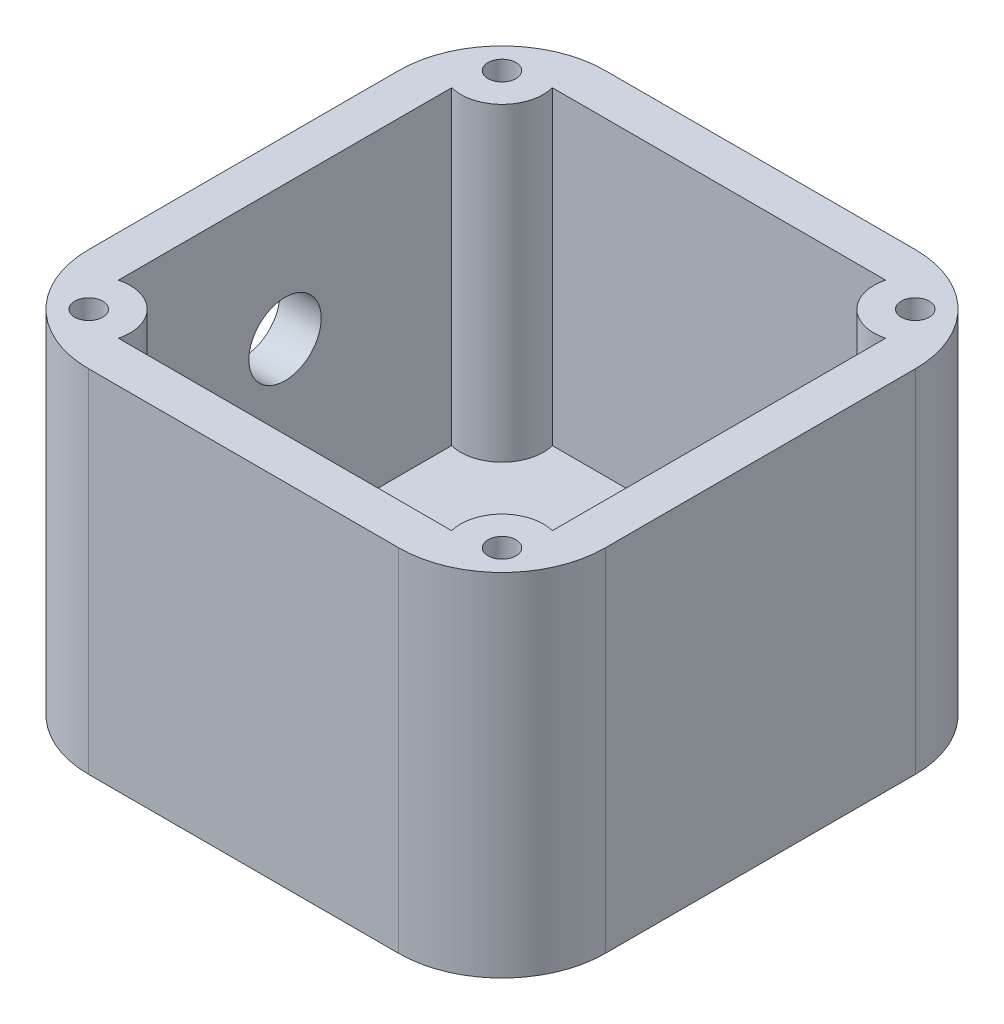
ISO-10303-21;
HEADER;
FILE_DESCRIPTION(('STEP AP214'),'2;1');
FILE_NAME('part.step','',(''),(''),'','','');
FILE_SCHEMA(('AUTOMOTIVE_DESIGN { 1 0 10303 214 1 1 1 1 }'));
ENDSEC;
DATA;
#1=APPLICATION_CONTEXT('core data for automotive mechanical design processes');
#2=APPLICATION_PROTOCOL_DEFINITION('international standard','automotive_design',2000,#1);
#3=PRODUCT_CONTEXT('',#1,'mechanical');
#4=PRODUCT('Part','Part','',(#3));
#5=PRODUCT_RELATED_PRODUCT_CATEGORY('part','',(#4));
#6=PRODUCT_DEFINITION_FORMATION('','',#4);
#7=PRODUCT_DEFINITION_CONTEXT('part definition',#1,'design');
#8=PRODUCT_DEFINITION('design','',#6,#7);
#9=PRODUCT_DEFINITION_SHAPE('','',#8);
#10=(LENGTH_UNIT() NAMED_UNIT(*) SI_UNIT(.MILLI.,.METRE.));
#11=(NAMED_UNIT(*) PLANE_ANGLE_UNIT() SI_UNIT($,.RADIAN.));
#12=(NAMED_UNIT(*) SI_UNIT($,.STERADIAN.) SOLID_ANGLE_UNIT());
#13=UNCERTAINTY_MEASURE_WITH_UNIT(LENGTH_MEASURE(1.E-05),#10,'distance_accuracy_value','');
#14=(GEOMETRIC_REPRESENTATION_CONTEXT(3) GLOBAL_UNCERTAINTY_ASSIGNED_CONTEXT((#13)) GLOBAL_UNIT_ASSIGNED_CONTEXT((#10,
#11,#12)) REPRESENTATION_CONTEXT('',''));
#15=CARTESIAN_POINT('',(0.,0.,0.));
#16=DIRECTION('',(0.,0.,1.));
#17=DIRECTION('',(1.,0.,0.));
#18=AXIS2_PLACEMENT_3D('',#15,#16,#17);
#19=CARTESIAN_POINT('',(25.,30.,-21.));
#20=DIRECTION('',(-1.,0.,0.));
#21=DIRECTION('',(0.,0.,1.));
#22=AXIS2_PLACEMENT_3D('',#19,#20,#21);
#23=PLANE('',#22);
#24=DIRECTION('',(0.,0.,-1.));
#25=VECTOR('',#24,1.);
#26=CARTESIAN_POINT('',(25.,30.,-21.));
#27=LINE('',#26,#25);
#28=CARTESIAN_POINT('',(25.,30.,15.));
#29=VERTEX_POINT('',#28);
#30=CARTESIAN_POINT('',(25.,30.,-15.));
#31=VERTEX_POINT('',#30);
#32=EDGE_CURVE('E308',#29,#31,#27,.T.);
#33=ORIENTED_EDGE('',*,*,#32,.F.);
#34=DIRECTION('',(0.,-1.,0.));
#35=VECTOR('',#34,1.);
#36=CARTESIAN_POINT('',(25.,30.,15.));
#37=LINE('',#36,#35);
#38=CARTESIAN_POINT('',(25.,-4.,15.));
#39=VERTEX_POINT('',#38);
#40=EDGE_CURVE('E384',#29,#39,#37,.T.);
#41=ORIENTED_EDGE('',*,*,#40,.T.);
#42=DIRECTION('',(0.,0.,-1.));
#43=VECTOR('',#42,1.);
#44=CARTESIAN_POINT('',(25.,-4.,-21.));
#45=LINE('',#44,#43);
#46=CARTESIAN_POINT('',(25.,-4.,-15.));
#47=VERTEX_POINT('',#46);
#48=EDGE_CURVE('E283',#39,#47,#45,.T.);
#49=ORIENTED_EDGE('',*,*,#48,.T.);
#50=DIRECTION('',(0.,-1.,0.));
#51=VECTOR('',#50,1.);
#52=CARTESIAN_POINT('',(25.,30.,-15.));
#53=LINE('',#52,#51);
#54=EDGE_CURVE('E381',#47,#31,#53,.F.);
#55=ORIENTED_EDGE('',*,*,#54,.T.);
#56=EDGE_LOOP('',(#33,#41,#49,#55));
#57=FACE_BOUND('',#56,.T.);
#58=ADVANCED_FACE('F45',(#57),#23,.F.);
#59=CARTESIAN_POINT('',(-21.,30.,-25.));
#60=DIRECTION('',(0.,0.,1.));
#61=DIRECTION('',(1.,0.,0.));
#62=AXIS2_PLACEMENT_3D('',#59,#60,#61);
#63=PLANE('',#62);
#64=DIRECTION('',(-1.,0.,0.));
#65=VECTOR('',#64,1.);
#66=CARTESIAN_POINT('',(-21.,30.,-25.));
#67=LINE('',#66,#65);
#68=CARTESIAN_POINT('',(15.,30.,-25.));
#69=VERTEX_POINT('',#68);
#70=CARTESIAN_POINT('',(-15.,30.,-25.));
#71=VERTEX_POINT('',#70);
#72=EDGE_CURVE('E311',#69,#71,#67,.T.);
#73=ORIENTED_EDGE('',*,*,#72,.F.);
#74=DIRECTION('',(0.,-1.,0.));
#75=VECTOR('',#74,1.);
#76=CARTESIAN_POINT('',(15.,30.,-25.));
#77=LINE('',#76,#75);
#78=CARTESIAN_POINT('',(15.,-4.,-25.));
#79=VERTEX_POINT('',#78);
#80=EDGE_CURVE('E11',#69,#79,#77,.T.);
#81=ORIENTED_EDGE('',*,*,#80,.T.);
#82=DIRECTION('',(-1.,0.,0.));
#83=VECTOR('',#82,1.);
#84=CARTESIAN_POINT('',(-21.,-4.,-25.));
#85=LINE('',#84,#83);
#86=CARTESIAN_POINT('',(-15.,-4.,-25.));
#87=VERTEX_POINT('',#86);
#88=EDGE_CURVE('E297',#79,#87,#85,.T.);
#89=ORIENTED_EDGE('',*,*,#88,.T.);
#90=DIRECTION('',(0.,-1.,0.));
#91=VECTOR('',#90,1.);
#92=CARTESIAN_POINT('',(-15.,30.,-25.));
#93=LINE('',#92,#91);
#94=EDGE_CURVE('E54',#87,#71,#93,.F.);
#95=ORIENTED_EDGE('',*,*,#94,.T.);
#96=EDGE_LOOP('',(#73,#81,#89,#95));
#97=FACE_BOUND('',#96,.T.);
#98=ADVANCED_FACE('F402',(#97),#63,.F.);
#99=CARTESIAN_POINT('',(-25.,30.,-21.));
#100=DIRECTION('',(1.,0.,0.));
#101=DIRECTION('',(0.,0.,-1.));
#102=AXIS2_PLACEMENT_3D('',#99,#100,#101);
#103=PLANE('',#102);
#104=CARTESIAN_POINT('',(-25.,17.,0.));
#105=DIRECTION('',(1.,0.,0.));
#106=DIRECTION('',(0.,0.,-1.));
#107=AXIS2_PLACEMENT_3D('',#104,#105,#106);
#108=CIRCLE('',#107,3.5);
#109=CARTESIAN_POINT('',(-25.,17.,-3.5));
#110=VERTEX_POINT('',#109);
#111=EDGE_CURVE('E264',#110,#110,#108,.T.);
#112=ORIENTED_EDGE('',*,*,#111,.T.);
#113=EDGE_LOOP('',(#112));
#114=FACE_BOUND('',#113,.T.);
#115=DIRECTION('',(0.,0.,1.));
#116=VECTOR('',#115,1.);
#117=CARTESIAN_POINT('',(-25.,-4.,-21.));
#118=LINE('',#117,#116);
#119=CARTESIAN_POINT('',(-25.,-4.,-15.));
#120=VERTEX_POINT('',#119);
#121=CARTESIAN_POINT('',(-25.,-4.,15.));
#122=VERTEX_POINT('',#121);
#123=EDGE_CURVE('E300',#120,#122,#118,.T.);
#124=ORIENTED_EDGE('',*,*,#123,.T.);
#125=DIRECTION('',(0.,-1.,0.));
#126=VECTOR('',#125,1.);
#127=CARTESIAN_POINT('',(-25.,30.,15.));
#128=LINE('',#127,#126);
#129=CARTESIAN_POINT('',(-25.,30.,15.));
#130=VERTEX_POINT('',#129);
#131=EDGE_CURVE('E367',#122,#130,#128,.F.);
#132=ORIENTED_EDGE('',*,*,#131,.T.);
#133=DIRECTION('',(0.,0.,1.));
#134=VECTOR('',#133,1.);
#135=CARTESIAN_POINT('',(-25.,30.,-21.));
#136=LINE('',#135,#134);
#137=CARTESIAN_POINT('',(-25.,30.,-15.));
#138=VERTEX_POINT('',#137);
#139=EDGE_CURVE('E314',#138,#130,#136,.T.);
#140=ORIENTED_EDGE('',*,*,#139,.F.);
#141=DIRECTION('',(0.,-1.,0.));
#142=VECTOR('',#141,1.);
#143=CARTESIAN_POINT('',(-25.,30.,-15.));
#144=LINE('',#143,#142);
#145=EDGE_CURVE('E363',#138,#120,#144,.T.);
#146=ORIENTED_EDGE('',*,*,#145,.T.);
#147=EDGE_LOOP('',(#124,#132,#140,#146));
#148=FACE_BOUND('',#147,.T.);
#149=ADVANCED_FACE('F410',(#114,#148),#103,.F.);
#150=CARTESIAN_POINT('',(-21.,30.,25.));
#151=DIRECTION('',(0.,0.,-1.));
#152=DIRECTION('',(-1.,0.,0.));
#153=AXIS2_PLACEMENT_3D('',#150,#151,#152);
#154=PLANE('',#153);
#155=DIRECTION('',(1.,0.,0.));
#156=VECTOR('',#155,1.);
#157=CARTESIAN_POINT('',(-21.,30.,25.));
#158=LINE('',#157,#156);
#159=CARTESIAN_POINT('',(-15.,30.,25.));
#160=VERTEX_POINT('',#159);
#161=CARTESIAN_POINT('',(15.,30.,25.));
#162=VERTEX_POINT('',#161);
#163=EDGE_CURVE('E318',#160,#162,#158,.T.);
#164=ORIENTED_EDGE('',*,*,#163,.F.);
#165=DIRECTION('',(0.,-1.,0.));
#166=VECTOR('',#165,1.);
#167=CARTESIAN_POINT('',(-15.,30.,25.));
#168=LINE('',#167,#166);
#169=CARTESIAN_POINT('',(-15.,-4.,25.));
#170=VERTEX_POINT('',#169);
#171=EDGE_CURVE('E347',#160,#170,#168,.T.);
#172=ORIENTED_EDGE('',*,*,#171,.T.);
#173=DIRECTION('',(1.,0.,0.));
#174=VECTOR('',#173,1.);
#175=CARTESIAN_POINT('',(-21.,-4.,25.));
#176=LINE('',#175,#174);
#177=CARTESIAN_POINT('',(15.,-4.,25.));
#178=VERTEX_POINT('',#177);
#179=EDGE_CURVE('E304',#170,#178,#176,.T.);
#180=ORIENTED_EDGE('',*,*,#179,.T.);
#181=DIRECTION('',(0.,-1.,0.));
#182=VECTOR('',#181,1.);
#183=CARTESIAN_POINT('',(15.,30.,25.));
#184=LINE('',#183,#182);
#185=EDGE_CURVE('E344',#178,#162,#184,.F.);
#186=ORIENTED_EDGE('',*,*,#185,.T.);
#187=EDGE_LOOP('',(#164,#172,#180,#186));
#188=FACE_BOUND('',#187,.T.);
#189=ADVANCED_FACE('F418',(#188),#154,.F.);
#190=CARTESIAN_POINT('',(0.,30.,0.));
#191=DIRECTION('',(0.,1.,0.));
#192=DIRECTION('',(0.,0.,1.));
#193=AXIS2_PLACEMENT_3D('',#190,#191,#192);
#194=PLANE('',#193);
#195=CARTESIAN_POINT('',(-20.,30.,-20.));
#196=DIRECTION('',(0.,1.,0.));
#197=DIRECTION('',(0.,0.,1.));
#198=AXIS2_PLACEMENT_3D('',#195,#196,#197);
#199=CIRCLE('',#198,1.35254999999999);
#200=CARTESIAN_POINT('',(-20.,30.,-18.64745));
#201=VERTEX_POINT('',#200);
#202=EDGE_CURVE('E182',#201,#201,#199,.T.);
#203=ORIENTED_EDGE('',*,*,#202,.F.);
#204=EDGE_LOOP('',(#203));
#205=FACE_BOUND('',#204,.T.);
#206=CARTESIAN_POINT('',(20.,30.,-20.));
#207=DIRECTION('',(0.,1.,0.));
#208=DIRECTION('',(0.,0.,1.));
#209=AXIS2_PLACEMENT_3D('',#206,#207,#208);
#210=CIRCLE('',#209,1.35254999999999);
#211=CARTESIAN_POINT('',(20.,30.,-18.64745));
#212=VERTEX_POINT('',#211);
#213=EDGE_CURVE('E181',#212,#212,#210,.T.);
#214=ORIENTED_EDGE('',*,*,#213,.F.);
#215=EDGE_LOOP('',(#214));
#216=FACE_BOUND('',#215,.T.);
#217=CARTESIAN_POINT('',(20.,30.,20.));
#218=DIRECTION('',(0.,1.,0.));
#219=DIRECTION('',(0.,0.,1.));
#220=AXIS2_PLACEMENT_3D('',#217,#218,#219);
#221=CIRCLE('',#220,1.35254999999999);
#222=CARTESIAN_POINT('',(20.,30.,21.35255));
#223=VERTEX_POINT('',#222);
#224=EDGE_CURVE('E195',#223,#223,#221,.T.);
#225=ORIENTED_EDGE('',*,*,#224,.F.);
#226=EDGE_LOOP('',(#225));
#227=FACE_BOUND('',#226,.T.);
#228=CARTESIAN_POINT('',(-20.,30.,20.));
#229=DIRECTION('',(0.,1.,0.));
#230=DIRECTION('',(0.,0.,1.));
#231=AXIS2_PLACEMENT_3D('',#228,#229,#230);
#232=CIRCLE('',#231,1.35254999999999);
#233=CARTESIAN_POINT('',(-20.,30.,21.35255));
#234=VERTEX_POINT('',#233);
#235=EDGE_CURVE('E203',#234,#234,#232,.T.);
#236=ORIENTED_EDGE('',*,*,#235,.F.);
#237=EDGE_LOOP('',(#236));
#238=FACE_BOUND('',#237,.T.);
#239=DIRECTION('',(0.,0.,1.));
#240=VECTOR('',#239,1.);
#241=CARTESIAN_POINT('',(-21.,30.,-21.));
#242=LINE('',#241,#240);
#243=CARTESIAN_POINT('',(-21.,30.,-16.1270166537926));
#244=VERTEX_POINT('',#243);
#245=CARTESIAN_POINT('',(-21.,30.,16.1270166537926));
#246=VERTEX_POINT('',#245);
#247=EDGE_CURVE('E277',#244,#246,#242,.T.);
#248=ORIENTED_EDGE('',*,*,#247,.F.);
#249=CARTESIAN_POINT('',(-20.,30.,-20.));
#250=DIRECTION('',(0.,-1.,0.));
#251=DIRECTION('',(0.,0.,-1.));
#252=AXIS2_PLACEMENT_3D('',#249,#250,#251);
#253=CIRCLE('',#252,4.);
#254=CARTESIAN_POINT('',(-16.1270166537926,30.,-21.));
#255=VERTEX_POINT('',#254);
#256=EDGE_CURVE('E211',#255,#244,#253,.T.);
#257=ORIENTED_EDGE('',*,*,#256,.F.);
#258=DIRECTION('',(-1.,0.,0.));
#259=VECTOR('',#258,1.);
#260=CARTESIAN_POINT('',(-21.,30.,-21.));
#261=LINE('',#260,#259);
#262=CARTESIAN_POINT('',(16.1270166537926,30.,-21.));
#263=VERTEX_POINT('',#262);
#264=EDGE_CURVE('E273',#263,#255,#261,.T.);
#265=ORIENTED_EDGE('',*,*,#264,.F.);
#266=CARTESIAN_POINT('',(20.,30.,-20.));
#267=DIRECTION('',(0.,-1.,0.));
#268=DIRECTION('',(0.,0.,-1.));
#269=AXIS2_PLACEMENT_3D('',#266,#267,#268);
#270=CIRCLE('',#269,4.);
#271=CARTESIAN_POINT('',(21.,30.,-16.1270166537926));
#272=VERTEX_POINT('',#271);
#273=EDGE_CURVE('E223',#272,#263,#270,.T.);
#274=ORIENTED_EDGE('',*,*,#273,.F.);
#275=DIRECTION('',(0.,0.,-1.));
#276=VECTOR('',#275,1.);
#277=CARTESIAN_POINT('',(21.,30.,-21.));
#278=LINE('',#277,#276);
#279=CARTESIAN_POINT('',(21.,30.,16.1270166537926));
#280=VERTEX_POINT('',#279);
#281=EDGE_CURVE('E270',#280,#272,#278,.T.);
#282=ORIENTED_EDGE('',*,*,#281,.F.);
#283=CARTESIAN_POINT('',(20.,30.,20.));
#284=DIRECTION('',(0.,-1.,0.));
#285=DIRECTION('',(0.,0.,-1.));
#286=AXIS2_PLACEMENT_3D('',#283,#284,#285);
#287=CIRCLE('',#286,4.);
#288=CARTESIAN_POINT('',(16.1270166537926,30.,21.));
#289=VERTEX_POINT('',#288);
#290=EDGE_CURVE('E235',#289,#280,#287,.T.);
#291=ORIENTED_EDGE('',*,*,#290,.F.);
#292=DIRECTION('',(1.,0.,0.));
#293=VECTOR('',#292,1.);
#294=CARTESIAN_POINT('',(-21.,30.,21.));
#295=LINE('',#294,#293);
#296=CARTESIAN_POINT('',(-16.1270166537926,30.,21.));
#297=VERTEX_POINT('',#296);
#298=EDGE_CURVE('E280',#297,#289,#295,.T.);
#299=ORIENTED_EDGE('',*,*,#298,.F.);
#300=CARTESIAN_POINT('',(-20.,30.,20.));
#301=DIRECTION('',(0.,-1.,0.));
#302=DIRECTION('',(0.,0.,-1.));
#303=AXIS2_PLACEMENT_3D('',#300,#301,#302);
#304=CIRCLE('',#303,4.);
#305=EDGE_CURVE('E247',#246,#297,#304,.T.);
#306=ORIENTED_EDGE('',*,*,#305,.F.);
#307=EDGE_LOOP('',(#248,#257,#265,#274,#282,#291,#299,#306));
#308=FACE_BOUND('',#307,.T.);
#309=ORIENTED_EDGE('',*,*,#139,.T.);
#310=CARTESIAN_POINT('',(-15.,30.,15.));
#311=DIRECTION('',(0.,1.,0.));
#312=DIRECTION('',(0.,0.,1.));
#313=AXIS2_PLACEMENT_3D('',#310,#311,#312);
#314=CIRCLE('',#313,10.);
#315=EDGE_CURVE('E378',#130,#160,#314,.T.);
#316=ORIENTED_EDGE('',*,*,#315,.T.);
#317=ORIENTED_EDGE('',*,*,#163,.T.);
#318=CARTESIAN_POINT('',(15.,30.,15.));
#319=DIRECTION('',(0.,1.,0.));
#320=DIRECTION('',(0.,0.,1.));
#321=AXIS2_PLACEMENT_3D('',#318,#319,#320);
#322=CIRCLE('',#321,10.);
#323=EDGE_CURVE('E375',#162,#29,#322,.T.);
#324=ORIENTED_EDGE('',*,*,#323,.T.);
#325=ORIENTED_EDGE('',*,*,#32,.T.);
#326=CARTESIAN_POINT('',(15.,30.,-15.));
#327=DIRECTION('',(0.,1.,0.));
#328=DIRECTION('',(0.,0.,1.));
#329=AXIS2_PLACEMENT_3D('',#326,#327,#328);
#330=CIRCLE('',#329,10.);
#331=EDGE_CURVE('E67',#31,#69,#330,.T.);
#332=ORIENTED_EDGE('',*,*,#331,.T.);
#333=ORIENTED_EDGE('',*,*,#72,.T.);
#334=CARTESIAN_POINT('',(-15.,30.,-15.));
#335=DIRECTION('',(0.,1.,0.));
#336=DIRECTION('',(0.,0.,1.));
#337=AXIS2_PLACEMENT_3D('',#334,#335,#336);
#338=CIRCLE('',#337,10.);
#339=EDGE_CURVE('E370',#71,#138,#338,.T.);
#340=ORIENTED_EDGE('',*,*,#339,.T.);
#341=EDGE_LOOP('',(#309,#316,#317,#324,#325,#332,#333,#340));
#342=FACE_BOUND('',#341,.T.);
#343=ADVANCED_FACE('F404',(#205,#216,#227,#238,#308,#342),#194,.T.);
#344=CARTESIAN_POINT('',(0.,-4.,0.));
#345=DIRECTION('',(0.,1.,0.));
#346=DIRECTION('',(0.,0.,1.));
#347=AXIS2_PLACEMENT_3D('',#344,#345,#346);
#348=PLANE('',#347);
#349=CARTESIAN_POINT('',(0.,-4.,0.));
#350=DIRECTION('',(0.,-1.,0.));
#351=DIRECTION('',(0.,0.,-1.));
#352=AXIS2_PLACEMENT_3D('',#349,#350,#351);
#353=CIRCLE('',#352,6.75);
#354=CARTESIAN_POINT('',(0.,-4.,-6.75));
#355=VERTEX_POINT('',#354);
#356=EDGE_CURVE('E259',#355,#355,#353,.T.);
#357=ORIENTED_EDGE('',*,*,#356,.F.);
#358=EDGE_LOOP('',(#357));
#359=FACE_BOUND('',#358,.T.);
#360=ORIENTED_EDGE('',*,*,#179,.F.);
#361=CARTESIAN_POINT('',(-15.,-4.,15.));
#362=DIRECTION('',(0.,1.,0.));
#363=DIRECTION('',(0.,0.,1.));
#364=AXIS2_PLACEMENT_3D('',#361,#362,#363);
#365=CIRCLE('',#364,10.);
#366=EDGE_CURVE('E360',#170,#122,#365,.F.);
#367=ORIENTED_EDGE('',*,*,#366,.T.);
#368=ORIENTED_EDGE('',*,*,#123,.F.);
#369=CARTESIAN_POINT('',(-15.,-4.,-15.));
#370=DIRECTION('',(0.,1.,0.));
#371=DIRECTION('',(0.,0.,1.));
#372=AXIS2_PLACEMENT_3D('',#369,#370,#371);
#373=CIRCLE('',#372,10.);
#374=EDGE_CURVE('E351',#120,#87,#373,.F.);
#375=ORIENTED_EDGE('',*,*,#374,.T.);
#376=ORIENTED_EDGE('',*,*,#88,.F.);
#377=CARTESIAN_POINT('',(15.,-4.,-15.));
#378=DIRECTION('',(0.,1.,0.));
#379=DIRECTION('',(0.,0.,1.));
#380=AXIS2_PLACEMENT_3D('',#377,#378,#379);
#381=CIRCLE('',#380,10.);
#382=EDGE_CURVE('E354',#79,#47,#381,.F.);
#383=ORIENTED_EDGE('',*,*,#382,.T.);
#384=ORIENTED_EDGE('',*,*,#48,.F.);
#385=CARTESIAN_POINT('',(15.,-4.,15.));
#386=DIRECTION('',(0.,1.,0.));
#387=DIRECTION('',(0.,0.,1.));
#388=AXIS2_PLACEMENT_3D('',#385,#386,#387);
#389=CIRCLE('',#388,10.);
#390=EDGE_CURVE('E357',#39,#178,#389,.F.);
#391=ORIENTED_EDGE('',*,*,#390,.T.);
#392=EDGE_LOOP('',(#360,#367,#368,#375,#376,#383,#384,#391));
#393=FACE_BOUND('',#392,.T.);
#394=ADVANCED_FACE('F397',(#359,#393),#348,.F.);
#395=CARTESIAN_POINT('',(21.,30.,-21.));
#396=DIRECTION('',(-1.,0.,0.));
#397=DIRECTION('',(0.,0.,1.));
#398=AXIS2_PLACEMENT_3D('',#395,#396,#397);
#399=PLANE('',#398);
#400=DIRECTION('',(0.,-1.,0.));
#401=VECTOR('',#400,1.);
#402=CARTESIAN_POINT('',(21.,30.,-16.1270166537926));
#403=LINE('',#402,#401);
#404=CARTESIAN_POINT('',(21.,0.,-16.1270166537926));
#405=VERTEX_POINT('',#404);
#406=EDGE_CURVE('E231',#405,#272,#403,.F.);
#407=ORIENTED_EDGE('',*,*,#406,.F.);
#408=DIRECTION('',(0.,0.,-1.));
#409=VECTOR('',#408,1.);
#410=CARTESIAN_POINT('',(21.,0.,-21.));
#411=LINE('',#410,#409);
#412=CARTESIAN_POINT('',(21.,0.,16.1270166537926));
#413=VERTEX_POINT('',#412);
#414=EDGE_CURVE('E268',#413,#405,#411,.T.);
#415=ORIENTED_EDGE('',*,*,#414,.F.);
#416=DIRECTION('',(0.,-1.,0.));
#417=VECTOR('',#416,1.);
#418=CARTESIAN_POINT('',(21.,30.,16.1270166537926));
#419=LINE('',#418,#417);
#420=EDGE_CURVE('E243',#280,#413,#419,.T.);
#421=ORIENTED_EDGE('',*,*,#420,.F.);
#422=ORIENTED_EDGE('',*,*,#281,.T.);
#423=EDGE_LOOP('',(#407,#415,#421,#422));
#424=FACE_BOUND('',#423,.T.);
#425=ADVANCED_FACE('F443',(#424),#399,.T.);
#426=CARTESIAN_POINT('',(-21.,30.,-21.));
#427=DIRECTION('',(0.,0.,1.));
#428=DIRECTION('',(1.,0.,0.));
#429=AXIS2_PLACEMENT_3D('',#426,#427,#428);
#430=PLANE('',#429);
#431=DIRECTION('',(0.,-1.,0.));
#432=VECTOR('',#431,1.);
#433=CARTESIAN_POINT('',(-16.1270166537926,30.,-21.));
#434=LINE('',#433,#432);
#435=CARTESIAN_POINT('',(-16.1270166537926,0.,-21.));
#436=VERTEX_POINT('',#435);
#437=EDGE_CURVE('E219',#436,#255,#434,.F.);
#438=ORIENTED_EDGE('',*,*,#437,.F.);
#439=DIRECTION('',(-1.,0.,0.));
#440=VECTOR('',#439,1.);
#441=CARTESIAN_POINT('',(-21.,0.,-21.));
#442=LINE('',#441,#440);
#443=CARTESIAN_POINT('',(16.1270166537926,0.,-21.));
#444=VERTEX_POINT('',#443);
#445=EDGE_CURVE('E286',#444,#436,#442,.T.);
#446=ORIENTED_EDGE('',*,*,#445,.F.);
#447=DIRECTION('',(0.,-1.,0.));
#448=VECTOR('',#447,1.);
#449=CARTESIAN_POINT('',(16.1270166537926,30.,-21.));
#450=LINE('',#449,#448);
#451=EDGE_CURVE('E227',#263,#444,#450,.T.);
#452=ORIENTED_EDGE('',*,*,#451,.F.);
#453=ORIENTED_EDGE('',*,*,#264,.T.);
#454=EDGE_LOOP('',(#438,#446,#452,#453));
#455=FACE_BOUND('',#454,.T.);
#456=ADVANCED_FACE('F449',(#455),#430,.T.);
#457=CARTESIAN_POINT('',(-21.,30.,-21.));
#458=DIRECTION('',(1.,0.,0.));
#459=DIRECTION('',(0.,0.,-1.));
#460=AXIS2_PLACEMENT_3D('',#457,#458,#459);
#461=PLANE('',#460);
#462=DIRECTION('',(0.,-1.,0.));
#463=VECTOR('',#462,1.);
#464=CARTESIAN_POINT('',(-21.,30.,-16.1270166537926));
#465=LINE('',#464,#463);
#466=CARTESIAN_POINT('',(-21.,0.,-16.1270166537926));
#467=VERTEX_POINT('',#466);
#468=EDGE_CURVE('E215',#244,#467,#465,.T.);
#469=ORIENTED_EDGE('',*,*,#468,.F.);
#470=ORIENTED_EDGE('',*,*,#247,.T.);
#471=DIRECTION('',(0.,-1.,0.));
#472=VECTOR('',#471,1.);
#473=CARTESIAN_POINT('',(-21.,30.,16.1270166537926));
#474=LINE('',#473,#472);
#475=CARTESIAN_POINT('',(-21.,0.,16.1270166537926));
#476=VERTEX_POINT('',#475);
#477=EDGE_CURVE('E255',#476,#246,#474,.F.);
#478=ORIENTED_EDGE('',*,*,#477,.F.);
#479=DIRECTION('',(0.,0.,1.));
#480=VECTOR('',#479,1.);
#481=CARTESIAN_POINT('',(-21.,0.,-21.));
#482=LINE('',#481,#480);
#483=EDGE_CURVE('E289',#467,#476,#482,.T.);
#484=ORIENTED_EDGE('',*,*,#483,.F.);
#485=EDGE_LOOP('',(#469,#470,#478,#484));
#486=FACE_BOUND('',#485,.T.);
#487=CARTESIAN_POINT('',(-21.,17.,0.));
#488=DIRECTION('',(1.,0.,0.));
#489=DIRECTION('',(0.,0.,-1.));
#490=AXIS2_PLACEMENT_3D('',#487,#488,#489);
#491=CIRCLE('',#490,3.5);
#492=CARTESIAN_POINT('',(-21.,17.,-3.5));
#493=VERTEX_POINT('',#492);
#494=EDGE_CURVE('E269',#493,#493,#491,.T.);
#495=ORIENTED_EDGE('',*,*,#494,.F.);
#496=EDGE_LOOP('',(#495));
#497=FACE_BOUND('',#496,.T.);
#498=ADVANCED_FACE('F478',(#486,#497),#461,.T.);
#499=CARTESIAN_POINT('',(-21.,30.,21.));
#500=DIRECTION('',(0.,0.,-1.));
#501=DIRECTION('',(-1.,0.,0.));
#502=AXIS2_PLACEMENT_3D('',#499,#500,#501);
#503=PLANE('',#502);
#504=DIRECTION('',(0.,-1.,0.));
#505=VECTOR('',#504,1.);
#506=CARTESIAN_POINT('',(16.1270166537926,30.,21.));
#507=LINE('',#506,#505);
#508=CARTESIAN_POINT('',(16.1270166537926,0.,21.));
#509=VERTEX_POINT('',#508);
#510=EDGE_CURVE('E239',#509,#289,#507,.F.);
#511=ORIENTED_EDGE('',*,*,#510,.F.);
#512=DIRECTION('',(1.,0.,0.));
#513=VECTOR('',#512,1.);
#514=CARTESIAN_POINT('',(-21.,0.,21.));
#515=LINE('',#514,#513);
#516=CARTESIAN_POINT('',(-16.1270166537926,0.,21.));
#517=VERTEX_POINT('',#516);
#518=EDGE_CURVE('E274',#517,#509,#515,.T.);
#519=ORIENTED_EDGE('',*,*,#518,.F.);
#520=DIRECTION('',(0.,-1.,0.));
#521=VECTOR('',#520,1.);
#522=CARTESIAN_POINT('',(-16.1270166537926,30.,21.));
#523=LINE('',#522,#521);
#524=EDGE_CURVE('E251',#297,#517,#523,.T.);
#525=ORIENTED_EDGE('',*,*,#524,.F.);
#526=ORIENTED_EDGE('',*,*,#298,.T.);
#527=EDGE_LOOP('',(#511,#519,#525,#526));
#528=FACE_BOUND('',#527,.T.);
#529=ADVANCED_FACE('F474',(#528),#503,.T.);
#530=CARTESIAN_POINT('',(0.,0.,0.));
#531=DIRECTION('',(0.,1.,0.));
#532=DIRECTION('',(0.,0.,1.));
#533=AXIS2_PLACEMENT_3D('',#530,#531,#532);
#534=PLANE('',#533);
#535=CARTESIAN_POINT('',(-20.,0.,-20.));
#536=DIRECTION('',(0.,1.,0.));
#537=DIRECTION('',(0.,0.,1.));
#538=AXIS2_PLACEMENT_3D('',#535,#536,#537);
#539=CIRCLE('',#538,4.);
#540=EDGE_CURVE('E340',#467,#436,#539,.T.);
#541=ORIENTED_EDGE('',*,*,#540,.F.);
#542=ORIENTED_EDGE('',*,*,#483,.T.);
#543=CARTESIAN_POINT('',(-20.,0.,20.));
#544=DIRECTION('',(0.,1.,0.));
#545=DIRECTION('',(0.,0.,1.));
#546=AXIS2_PLACEMENT_3D('',#543,#544,#545);
#547=CIRCLE('',#546,4.);
#548=EDGE_CURVE('E322',#517,#476,#547,.T.);
#549=ORIENTED_EDGE('',*,*,#548,.F.);
#550=ORIENTED_EDGE('',*,*,#518,.T.);
#551=CARTESIAN_POINT('',(20.,0.,20.));
#552=DIRECTION('',(0.,1.,0.));
#553=DIRECTION('',(0.,0.,1.));
#554=AXIS2_PLACEMENT_3D('',#551,#552,#553);
#555=CIRCLE('',#554,4.);
#556=EDGE_CURVE('E332',#413,#509,#555,.T.);
#557=ORIENTED_EDGE('',*,*,#556,.F.);
#558=ORIENTED_EDGE('',*,*,#414,.T.);
#559=CARTESIAN_POINT('',(20.,0.,-20.));
#560=DIRECTION('',(0.,1.,0.));
#561=DIRECTION('',(0.,0.,1.));
#562=AXIS2_PLACEMENT_3D('',#559,#560,#561);
#563=CIRCLE('',#562,4.);
#564=EDGE_CURVE('E336',#444,#405,#563,.T.);
#565=ORIENTED_EDGE('',*,*,#564,.F.);
#566=ORIENTED_EDGE('',*,*,#445,.T.);
#567=EDGE_LOOP('',(#541,#542,#549,#550,#557,#558,#565,#566));
#568=FACE_BOUND('',#567,.T.);
#569=CARTESIAN_POINT('',(0.,0.,0.));
#570=DIRECTION('',(0.,1.,0.));
#571=DIRECTION('',(0.,0.,1.));
#572=AXIS2_PLACEMENT_3D('',#569,#570,#571);
#573=CIRCLE('',#572,6.75);
#574=CARTESIAN_POINT('',(0.,0.,6.75));
#575=VERTEX_POINT('',#574);
#576=EDGE_CURVE('E263',#575,#575,#573,.T.);
#577=ORIENTED_EDGE('',*,*,#576,.F.);
#578=EDGE_LOOP('',(#577));
#579=FACE_BOUND('',#578,.T.);
#580=ADVANCED_FACE('F467',(#568,#579),#534,.T.);
#581=CARTESIAN_POINT('',(-30.,17.,0.));
#582=DIRECTION('',(1.,0.,0.));
#583=DIRECTION('',(0.,0.,-1.));
#584=AXIS2_PLACEMENT_3D('',#581,#582,#583);
#585=CYLINDRICAL_SURFACE('',#584,3.5);
#586=CARTESIAN_POINT('',(-21.,17.,-3.5));
#587=CARTESIAN_POINT('',(-21.0416666666667,17.,-3.5));
#588=CARTESIAN_POINT('',(-21.0833333333333,17.,-3.5));
#589=CARTESIAN_POINT('',(-21.1666666666667,17.,-3.5));
#590=CARTESIAN_POINT('',(-21.2083333333333,17.,-3.5));
#591=CARTESIAN_POINT('',(-21.2916666666667,17.,-3.5));
#592=CARTESIAN_POINT('',(-21.3333333333333,17.,-3.5));
#593=CARTESIAN_POINT('',(-21.4166666666667,17.,-3.5));
#594=CARTESIAN_POINT('',(-21.4583333333333,17.,-3.5));
#595=CARTESIAN_POINT('',(-21.5416666666667,17.,-3.5));
#596=CARTESIAN_POINT('',(-21.5833333333333,17.,-3.5));
#597=CARTESIAN_POINT('',(-21.6666666666667,17.,-3.5));
#598=CARTESIAN_POINT('',(-21.7083333333333,17.,-3.5));
#599=CARTESIAN_POINT('',(-21.7916666666667,17.,-3.5));
#600=CARTESIAN_POINT('',(-21.8333333333333,17.,-3.5));
#601=CARTESIAN_POINT('',(-21.9166666666667,17.,-3.5));
#602=CARTESIAN_POINT('',(-21.9583333333333,17.,-3.5));
#603=CARTESIAN_POINT('',(-22.0416666666667,17.,-3.5));
#604=CARTESIAN_POINT('',(-22.0833333333333,17.,-3.5));
#605=CARTESIAN_POINT('',(-22.1666666666667,17.,-3.5));
#606=CARTESIAN_POINT('',(-22.2083333333333,17.,-3.5));
#607=CARTESIAN_POINT('',(-22.2916666666667,17.,-3.5));
#608=CARTESIAN_POINT('',(-22.3333333333333,17.,-3.5));
#609=CARTESIAN_POINT('',(-22.4166666666667,17.,-3.5));
#610=CARTESIAN_POINT('',(-22.4583333333333,17.,-3.5));
#611=CARTESIAN_POINT('',(-22.5416666666667,17.,-3.5));
#612=CARTESIAN_POINT('',(-22.5833333333333,17.,-3.5));
#613=CARTESIAN_POINT('',(-22.6666666666667,17.,-3.5));
#614=CARTESIAN_POINT('',(-22.7083333333333,17.,-3.5));
#615=CARTESIAN_POINT('',(-22.7916666666667,17.,-3.5));
#616=CARTESIAN_POINT('',(-22.8333333333333,17.,-3.5));
#617=CARTESIAN_POINT('',(-22.9166666666667,17.,-3.5));
#618=CARTESIAN_POINT('',(-22.9583333333333,17.,-3.5));
#619=CARTESIAN_POINT('',(-23.0416666666667,17.,-3.5));
#620=CARTESIAN_POINT('',(-23.0833333333333,17.,-3.5));
#621=CARTESIAN_POINT('',(-23.1666666666667,17.,-3.5));
#622=CARTESIAN_POINT('',(-23.2083333333333,17.,-3.5));
#623=CARTESIAN_POINT('',(-23.2916666666667,17.,-3.5));
#624=CARTESIAN_POINT('',(-23.3333333333333,17.,-3.5));
#625=CARTESIAN_POINT('',(-23.4166666666667,17.,-3.5));
#626=CARTESIAN_POINT('',(-23.4583333333333,17.,-3.5));
#627=CARTESIAN_POINT('',(-23.5416666666667,17.,-3.5));
#628=CARTESIAN_POINT('',(-23.5833333333333,17.,-3.5));
#629=CARTESIAN_POINT('',(-23.6666666666667,17.,-3.5));
#630=CARTESIAN_POINT('',(-23.7083333333333,17.,-3.5));
#631=CARTESIAN_POINT('',(-23.7916666666667,17.,-3.5));
#632=CARTESIAN_POINT('',(-23.8333333333333,17.,-3.5));
#633=CARTESIAN_POINT('',(-23.9166666666667,17.,-3.5));
#634=CARTESIAN_POINT('',(-23.9583333333333,17.,-3.5));
#635=CARTESIAN_POINT('',(-24.0416666666667,17.,-3.5));
#636=CARTESIAN_POINT('',(-24.0833333333333,17.,-3.5));
#637=CARTESIAN_POINT('',(-24.1666666666667,17.,-3.5));
#638=CARTESIAN_POINT('',(-24.2083333333333,17.,-3.5));
#639=CARTESIAN_POINT('',(-24.2916666666667,17.,-3.5));
#640=CARTESIAN_POINT('',(-24.3333333333333,17.,-3.5));
#641=CARTESIAN_POINT('',(-24.4166666666667,17.,-3.5));
#642=CARTESIAN_POINT('',(-24.4583333333333,17.,-3.5));
#643=CARTESIAN_POINT('',(-24.5416666666667,17.,-3.5));
#644=CARTESIAN_POINT('',(-24.5833333333333,17.,-3.5));
#645=CARTESIAN_POINT('',(-24.6666666666667,17.,-3.5));
#646=CARTESIAN_POINT('',(-24.7083333333333,17.,-3.5));
#647=CARTESIAN_POINT('',(-24.7916666666667,17.,-3.5));
#648=CARTESIAN_POINT('',(-24.8333333333333,17.,-3.5));
#649=CARTESIAN_POINT('',(-24.9166666666667,17.,-3.5));
#650=CARTESIAN_POINT('',(-24.9583333333333,17.,-3.5));
#651=CARTESIAN_POINT('',(-25.,17.,-3.5));
#652=B_SPLINE_CURVE_WITH_KNOTS('',3,(#586,#587,#588,#589,#590,#591,#592,#593,#594,#595,#596,
#597,#598,#599,#600,#601,#602,#603,#604,#605,#606,#607,#608,#609,#610,#611,#612,#613,#614,#615,
#616,#617,#618,#619,#620,#621,#622,#623,#624,#625,#626,#627,#628,#629,#630,#631,#632,#633,#634,
#635,#636,#637,#638,#639,#640,#641,#642,#643,#644,#645,#646,#647,#648,#649,#650,#651),
.UNSPECIFIED.,.F.,.F.,(4,2,2,2,2,2,2,2,2,2,2,2,2,2,2,2,2,2,2,2,2,2,2,2,2,2,2,2,2,2,2,2,4),(0.,
0.125,0.25,0.375,0.5,0.625000000000001,0.750000000000001,0.875000000000001,1.,1.125,1.25,1.375,
1.5,1.625,1.75,1.875,2.,2.125,2.25,2.375,2.5,2.625,2.75,2.875,3.,3.125,3.25,3.375,3.5,3.625,
3.75,3.875,4.),.UNSPECIFIED.);
#653=EDGE_CURVE('BSEAM457',#493,#110,#652,.T.);
#654=ORIENTED_EDGE('',*,*,#494,.T.);
#655=ORIENTED_EDGE('',*,*,#111,.F.);
#656=ORIENTED_EDGE('',*,*,#653,.T.);
#657=ORIENTED_EDGE('',*,*,#653,.F.);
#658=EDGE_LOOP('',(#654,#656,#655,#657));
#659=FACE_BOUND('',#658,.T.);
#660=ADVANCED_FACE('F457',(#659),#585,.F.);
#661=CARTESIAN_POINT('',(0.,26.,0.));
#662=DIRECTION('',(0.,-1.,0.));
#663=DIRECTION('',(0.,0.,-1.));
#664=AXIS2_PLACEMENT_3D('',#661,#662,#663);
#665=CYLINDRICAL_SURFACE('',#664,6.75);
#666=ORIENTED_EDGE('',*,*,#576,.T.);
#667=EDGE_LOOP('',(#666));
#668=FACE_BOUND('',#667,.T.);
#669=ORIENTED_EDGE('',*,*,#356,.T.);
#670=EDGE_LOOP('',(#669));
#671=FACE_BOUND('',#670,.T.);
#672=ADVANCED_FACE('F454',(#668,#671),#665,.F.);
#673=CARTESIAN_POINT('',(-20.,30.,20.));
#674=DIRECTION('',(0.,-1.,0.));
#675=DIRECTION('',(0.,0.,-1.));
#676=AXIS2_PLACEMENT_3D('',#673,#674,#675);
#677=CYLINDRICAL_SURFACE('',#676,4.);
#678=ORIENTED_EDGE('',*,*,#548,.T.);
#679=ORIENTED_EDGE('',*,*,#477,.T.);
#680=ORIENTED_EDGE('',*,*,#305,.T.);
#681=ORIENTED_EDGE('',*,*,#524,.T.);
#682=EDGE_LOOP('',(#678,#679,#680,#681));
#683=FACE_BOUND('',#682,.T.);
#684=ADVANCED_FACE('F456',(#683),#677,.T.);
#685=CARTESIAN_POINT('',(20.,30.,20.));
#686=DIRECTION('',(0.,-1.,0.));
#687=DIRECTION('',(0.,0.,-1.));
#688=AXIS2_PLACEMENT_3D('',#685,#686,#687);
#689=CYLINDRICAL_SURFACE('',#688,4.);
#690=ORIENTED_EDGE('',*,*,#290,.T.);
#691=ORIENTED_EDGE('',*,*,#420,.T.);
#692=ORIENTED_EDGE('',*,*,#556,.T.);
#693=ORIENTED_EDGE('',*,*,#510,.T.);
#694=EDGE_LOOP('',(#690,#691,#692,#693));
#695=FACE_BOUND('',#694,.T.);
#696=ADVANCED_FACE('F464',(#695),#689,.T.);
#697=CARTESIAN_POINT('',(20.,30.,-20.));
#698=DIRECTION('',(0.,-1.,0.));
#699=DIRECTION('',(0.,0.,-1.));
#700=AXIS2_PLACEMENT_3D('',#697,#698,#699);
#701=CYLINDRICAL_SURFACE('',#700,4.);
#702=ORIENTED_EDGE('',*,*,#564,.T.);
#703=ORIENTED_EDGE('',*,*,#406,.T.);
#704=ORIENTED_EDGE('',*,*,#273,.T.);
#705=ORIENTED_EDGE('',*,*,#451,.T.);
#706=EDGE_LOOP('',(#702,#703,#704,#705));
#707=FACE_BOUND('',#706,.T.);
#708=ADVANCED_FACE('F509',(#707),#701,.T.);
#709=CARTESIAN_POINT('',(-20.,30.,-20.));
#710=DIRECTION('',(0.,-1.,0.));
#711=DIRECTION('',(0.,0.,-1.));
#712=AXIS2_PLACEMENT_3D('',#709,#710,#711);
#713=CYLINDRICAL_SURFACE('',#712,4.);
#714=ORIENTED_EDGE('',*,*,#540,.T.);
#715=ORIENTED_EDGE('',*,*,#437,.T.);
#716=ORIENTED_EDGE('',*,*,#256,.T.);
#717=ORIENTED_EDGE('',*,*,#468,.T.);
#718=EDGE_LOOP('',(#714,#715,#716,#717));
#719=FACE_BOUND('',#718,.T.);
#720=ADVANCED_FACE('F492',(#719),#713,.T.);
#721=CARTESIAN_POINT('',(-20.,19.03,20.));
#722=DIRECTION('',(0.,1.,0.));
#723=DIRECTION('',(0.,0.,1.));
#724=AXIS2_PLACEMENT_3D('',#721,#722,#723);
#725=CONICAL_SURFACE('',#724,1.35254999999999,1.02974425867665);
#726=CARTESIAN_POINT('',(-20.,18.2173059697343,20.));
#727=VERTEX_POINT('',#726);
#728=VERTEX_LOOP('',#727);
#729=FACE_BOUND('',#728,.T.);
#730=CARTESIAN_POINT('',(-20.,19.03,20.));
#731=DIRECTION('',(0.,1.,0.));
#732=DIRECTION('',(0.,0.,1.));
#733=AXIS2_PLACEMENT_3D('',#730,#731,#732);
#734=CIRCLE('',#733,1.35254999999999);
#735=CARTESIAN_POINT('',(-20.,19.03,21.35255));
#736=VERTEX_POINT('',#735);
#737=EDGE_CURVE('E207',#736,#736,#734,.T.);
#738=ORIENTED_EDGE('',*,*,#737,.T.);
#739=EDGE_LOOP('',(#738));
#740=FACE_BOUND('',#739,.T.);
#741=ADVANCED_FACE('F517',(#729,#740),#725,.F.);
#742=CARTESIAN_POINT('',(-20.,30.,20.));
#743=DIRECTION('',(0.,1.,0.));
#744=DIRECTION('',(0.,0.,1.));
#745=AXIS2_PLACEMENT_3D('',#742,#743,#744);
#746=CYLINDRICAL_SURFACE('',#745,1.35254999999999);
#747=ORIENTED_EDGE('',*,*,#737,.F.);
#748=EDGE_LOOP('',(#747));
#749=FACE_BOUND('',#748,.T.);
#750=ORIENTED_EDGE('',*,*,#235,.T.);
#751=EDGE_LOOP('',(#750));
#752=FACE_BOUND('',#751,.T.);
#753=ADVANCED_FACE('F522',(#749,#752),#746,.F.);
#754=CARTESIAN_POINT('',(20.,19.03,20.));
#755=DIRECTION('',(0.,1.,0.));
#756=DIRECTION('',(0.,0.,1.));
#757=AXIS2_PLACEMENT_3D('',#754,#755,#756);
#758=CONICAL_SURFACE('',#757,1.35254999999999,1.02974425867665);
#759=CARTESIAN_POINT('',(20.,18.2173059697343,20.));
#760=VERTEX_POINT('',#759);
#761=VERTEX_LOOP('',#760);
#762=FACE_BOUND('',#761,.T.);
#763=CARTESIAN_POINT('',(20.,19.03,20.));
#764=DIRECTION('',(0.,1.,0.));
#765=DIRECTION('',(0.,0.,1.));
#766=AXIS2_PLACEMENT_3D('',#763,#764,#765);
#767=CIRCLE('',#766,1.35254999999999);
#768=CARTESIAN_POINT('',(20.,19.03,21.35255));
#769=VERTEX_POINT('',#768);
#770=EDGE_CURVE('E199',#769,#769,#767,.T.);
#771=ORIENTED_EDGE('',*,*,#770,.T.);
#772=EDGE_LOOP('',(#771));
#773=FACE_BOUND('',#772,.T.);
#774=ADVANCED_FACE('F526',(#762,#773),#758,.F.);
#775=CARTESIAN_POINT('',(20.,30.,20.));
#776=DIRECTION('',(0.,1.,0.));
#777=DIRECTION('',(0.,0.,1.));
#778=AXIS2_PLACEMENT_3D('',#775,#776,#777);
#779=CYLINDRICAL_SURFACE('',#778,1.35254999999999);
#780=ORIENTED_EDGE('',*,*,#770,.F.);
#781=EDGE_LOOP('',(#780));
#782=FACE_BOUND('',#781,.T.);
#783=ORIENTED_EDGE('',*,*,#224,.T.);
#784=EDGE_LOOP('',(#783));
#785=FACE_BOUND('',#784,.T.);
#786=ADVANCED_FACE('F530',(#782,#785),#779,.F.);
#787=CARTESIAN_POINT('',(20.,19.03,-20.));
#788=DIRECTION('',(0.,1.,0.));
#789=DIRECTION('',(0.,0.,1.));
#790=AXIS2_PLACEMENT_3D('',#787,#788,#789);
#791=CONICAL_SURFACE('',#790,1.35254999999999,1.02974425867665);
#792=CARTESIAN_POINT('',(20.,18.2173059697343,-20.));
#793=VERTEX_POINT('',#792);
#794=VERTEX_LOOP('',#793);
#795=FACE_BOUND('',#794,.T.);
#796=CARTESIAN_POINT('',(20.,19.03,-20.));
#797=DIRECTION('',(0.,1.,0.));
#798=DIRECTION('',(0.,0.,1.));
#799=AXIS2_PLACEMENT_3D('',#796,#797,#798);
#800=CIRCLE('',#799,1.35254999999999);
#801=CARTESIAN_POINT('',(20.,19.03,-18.64745));
#802=VERTEX_POINT('',#801);
#803=EDGE_CURVE('E187',#802,#802,#800,.T.);
#804=ORIENTED_EDGE('',*,*,#803,.T.);
#805=EDGE_LOOP('',(#804));
#806=FACE_BOUND('',#805,.T.);
#807=ADVANCED_FACE('F534',(#795,#806),#791,.F.);
#808=CARTESIAN_POINT('',(20.,30.,-20.));
#809=DIRECTION('',(0.,1.,0.));
#810=DIRECTION('',(0.,0.,1.));
#811=AXIS2_PLACEMENT_3D('',#808,#809,#810);
#812=CYLINDRICAL_SURFACE('',#811,1.35254999999999);
#813=ORIENTED_EDGE('',*,*,#803,.F.);
#814=EDGE_LOOP('',(#813));
#815=FACE_BOUND('',#814,.T.);
#816=ORIENTED_EDGE('',*,*,#213,.T.);
#817=EDGE_LOOP('',(#816));
#818=FACE_BOUND('',#817,.T.);
#819=ADVANCED_FACE('F174',(#815,#818),#812,.F.);
#820=CARTESIAN_POINT('',(-20.,19.03,-20.));
#821=DIRECTION('',(0.,1.,0.));
#822=DIRECTION('',(0.,0.,1.));
#823=AXIS2_PLACEMENT_3D('',#820,#821,#822);
#824=CONICAL_SURFACE('',#823,1.35254999999999,1.02974425867665);
#825=CARTESIAN_POINT('',(-20.,18.2173059697343,-20.));
#826=VERTEX_POINT('',#825);
#827=VERTEX_LOOP('',#826);
#828=FACE_BOUND('',#827,.T.);
#829=CARTESIAN_POINT('',(-20.,19.03,-20.));
#830=DIRECTION('',(0.,1.,0.));
#831=DIRECTION('',(0.,0.,1.));
#832=AXIS2_PLACEMENT_3D('',#829,#830,#831);
#833=CIRCLE('',#832,1.35254999999999);
#834=CARTESIAN_POINT('',(-20.,19.03,-18.64745));
#835=VERTEX_POINT('',#834);
#836=EDGE_CURVE('E178',#835,#835,#833,.T.);
#837=ORIENTED_EDGE('',*,*,#836,.T.);
#838=EDGE_LOOP('',(#837));
#839=FACE_BOUND('',#838,.T.);
#840=ADVANCED_FACE('F170',(#828,#839),#824,.F.);
#841=CARTESIAN_POINT('',(-20.,30.,-20.));
#842=DIRECTION('',(0.,1.,0.));
#843=DIRECTION('',(0.,0.,1.));
#844=AXIS2_PLACEMENT_3D('',#841,#842,#843);
#845=CYLINDRICAL_SURFACE('',#844,1.35254999999999);
#846=ORIENTED_EDGE('',*,*,#836,.F.);
#847=EDGE_LOOP('',(#846));
#848=FACE_BOUND('',#847,.T.);
#849=ORIENTED_EDGE('',*,*,#202,.T.);
#850=EDGE_LOOP('',(#849));
#851=FACE_BOUND('',#850,.T.);
#852=ADVANCED_FACE('F173',(#848,#851),#845,.F.);
#853=CARTESIAN_POINT('',(-15.,30.,15.));
#854=DIRECTION('',(0.,-1.,0.));
#855=DIRECTION('',(0.,0.,-1.));
#856=AXIS2_PLACEMENT_3D('',#853,#854,#855);
#857=CYLINDRICAL_SURFACE('',#856,10.);
#858=ORIENTED_EDGE('',*,*,#315,.F.);
#859=ORIENTED_EDGE('',*,*,#131,.F.);
#860=ORIENTED_EDGE('',*,*,#366,.F.);
#861=ORIENTED_EDGE('',*,*,#171,.F.);
#862=EDGE_LOOP('',(#858,#859,#860,#861));
#863=FACE_BOUND('',#862,.T.);
#864=ADVANCED_FACE('F415',(#863),#857,.T.);
#865=CARTESIAN_POINT('',(15.,30.,15.));
#866=DIRECTION('',(0.,-1.,0.));
#867=DIRECTION('',(0.,0.,-1.));
#868=AXIS2_PLACEMENT_3D('',#865,#866,#867);
#869=CYLINDRICAL_SURFACE('',#868,10.);
#870=ORIENTED_EDGE('',*,*,#323,.F.);
#871=ORIENTED_EDGE('',*,*,#185,.F.);
#872=ORIENTED_EDGE('',*,*,#390,.F.);
#873=ORIENTED_EDGE('',*,*,#40,.F.);
#874=EDGE_LOOP('',(#870,#871,#872,#873));
#875=FACE_BOUND('',#874,.T.);
#876=ADVANCED_FACE('F420',(#875),#869,.T.);
#877=CARTESIAN_POINT('',(15.,30.,-15.));
#878=DIRECTION('',(0.,-1.,0.));
#879=DIRECTION('',(0.,0.,-1.));
#880=AXIS2_PLACEMENT_3D('',#877,#878,#879);
#881=CYLINDRICAL_SURFACE('',#880,10.);
#882=ORIENTED_EDGE('',*,*,#331,.F.);
#883=ORIENTED_EDGE('',*,*,#54,.F.);
#884=ORIENTED_EDGE('',*,*,#382,.F.);
#885=ORIENTED_EDGE('',*,*,#80,.F.);
#886=EDGE_LOOP('',(#882,#883,#884,#885));
#887=FACE_BOUND('',#886,.T.);
#888=ADVANCED_FACE('F401',(#887),#881,.T.);
#889=CARTESIAN_POINT('',(-15.,30.,-15.));
#890=DIRECTION('',(0.,-1.,0.));
#891=DIRECTION('',(0.,0.,-1.));
#892=AXIS2_PLACEMENT_3D('',#889,#890,#891);
#893=CYLINDRICAL_SURFACE('',#892,10.);
#894=ORIENTED_EDGE('',*,*,#339,.F.);
#895=ORIENTED_EDGE('',*,*,#94,.F.);
#896=ORIENTED_EDGE('',*,*,#374,.F.);
#897=ORIENTED_EDGE('',*,*,#145,.F.);
#898=EDGE_LOOP('',(#894,#895,#896,#897));
#899=FACE_BOUND('',#898,.T.);
#900=ADVANCED_FACE('F47',(#899),#893,.T.);
#901=CLOSED_SHELL('',(#58,#98,#149,#189,#343,#394,#425,#456,#498,#529,#580,#660,#672,#684,#696,
#708,#720,#741,#753,#774,#786,#807,#819,#840,#852,#864,#876,#888,#900));
#902=MANIFOLD_SOLID_BREP('B2',#901);
#903=ADVANCED_BREP_SHAPE_REPRESENTATION('',(#18,#902),#14);
#904=SHAPE_DEFINITION_REPRESENTATION(#9,#903);
ENDSEC;
END-ISO-10303-21;
